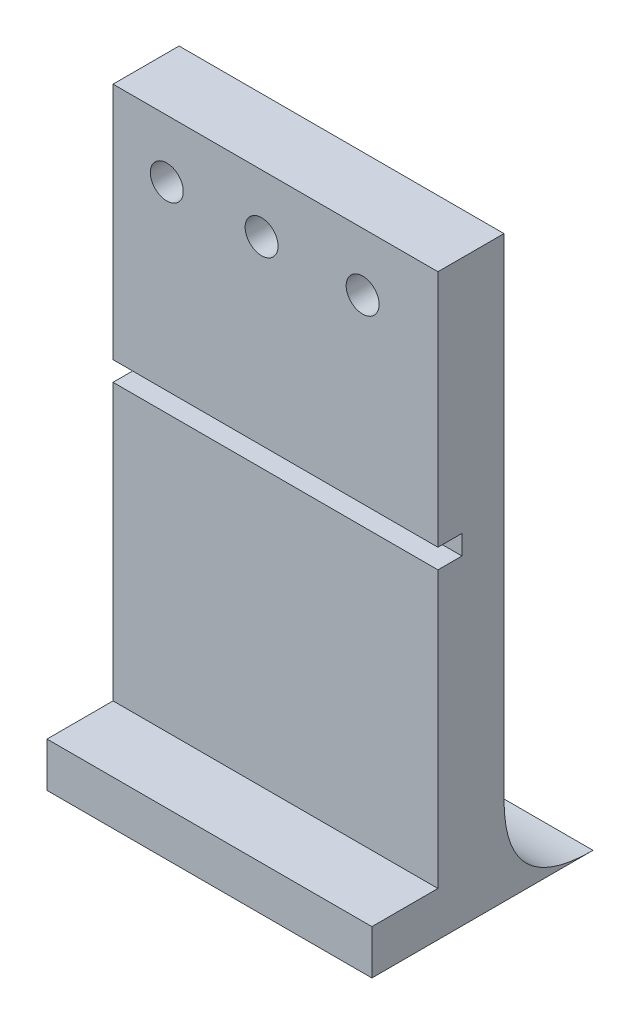
ISO-10303-21;
HEADER;
FILE_DESCRIPTION(('STEP AP214'),'2;1');
FILE_NAME('part.step','',(''),(''),'','','');
FILE_SCHEMA(('AUTOMOTIVE_DESIGN { 1 0 10303 214 1 1 1 1 }'));
ENDSEC;
DATA;
#1=APPLICATION_CONTEXT('core data for automotive mechanical design processes');
#2=APPLICATION_PROTOCOL_DEFINITION('international standard','automotive_design',2000,#1);
#3=PRODUCT_CONTEXT('',#1,'mechanical');
#4=PRODUCT('Part','Part','',(#3));
#5=PRODUCT_RELATED_PRODUCT_CATEGORY('part','',(#4));
#6=PRODUCT_DEFINITION_FORMATION('','',#4);
#7=PRODUCT_DEFINITION_CONTEXT('part definition',#1,'design');
#8=PRODUCT_DEFINITION('design','',#6,#7);
#9=PRODUCT_DEFINITION_SHAPE('','',#8);
#10=(LENGTH_UNIT() NAMED_UNIT(*) SI_UNIT(.MILLI.,.METRE.));
#11=(NAMED_UNIT(*) PLANE_ANGLE_UNIT() SI_UNIT($,.RADIAN.));
#12=(NAMED_UNIT(*) SI_UNIT($,.STERADIAN.) SOLID_ANGLE_UNIT());
#13=UNCERTAINTY_MEASURE_WITH_UNIT(LENGTH_MEASURE(1.E-05),#10,'distance_accuracy_value','');
#14=(GEOMETRIC_REPRESENTATION_CONTEXT(3) GLOBAL_UNCERTAINTY_ASSIGNED_CONTEXT((#13)) GLOBAL_UNIT_ASSIGNED_CONTEXT((#10,
#11,#12)) REPRESENTATION_CONTEXT('',''));
#15=CARTESIAN_POINT('',(0.,0.,0.));
#16=DIRECTION('',(0.,0.,1.));
#17=DIRECTION('',(1.,0.,0.));
#18=AXIS2_PLACEMENT_3D('',#15,#16,#17);
#19=CARTESIAN_POINT('',(-6.61487977012459,86.9756657215737,123.391810220685));
#20=DIRECTION('',(0.,-1.,0.));
#21=DIRECTION('',(-1.,0.,0.));
#22=AXIS2_PLACEMENT_3D('',#19,#20,#21);
#23=PLANE('',#22);
#24=DIRECTION('',(0.,0.,-1.));
#25=VECTOR('',#24,1.);
#26=CARTESIAN_POINT('',(29.8795748109969,86.975665721574,135.86462945309));
#27=LINE('',#26,#25);
#28=CARTESIAN_POINT('',(29.8795748109969,86.975665721574,150.703034062997));
#29=VERTEX_POINT('',#28);
#30=CARTESIAN_POINT('',(29.8795748109969,86.975665721574,125.86462945309));
#31=VERTEX_POINT('',#30);
#32=EDGE_CURVE('E137',#29,#31,#27,.T.);
#33=ORIENTED_EDGE('',*,*,#32,.F.);
#34=DIRECTION('',(1.,0.,0.));
#35=VECTOR('',#34,1.);
#36=CARTESIAN_POINT('',(-6.61487977012459,86.9756657215737,150.703034062997));
#37=LINE('',#36,#35);
#38=CARTESIAN_POINT('',(-6.61487977012459,86.9756657215737,150.703034062997));
#39=VERTEX_POINT('',#38);
#40=EDGE_CURVE('E291',#39,#29,#37,.T.);
#41=ORIENTED_EDGE('',*,*,#40,.F.);
#42=DIRECTION('',(0.,0.,1.));
#43=VECTOR('',#42,1.);
#44=CARTESIAN_POINT('',(-6.61487977012459,86.9756657215737,135.86462945309));
#45=LINE('',#44,#43);
#46=CARTESIAN_POINT('',(-6.61490549374412,86.9756657215737,126.010686228357));
#47=VERTEX_POINT('',#46);
#48=EDGE_CURVE('E243',#47,#39,#45,.T.);
#49=ORIENTED_EDGE('',*,*,#48,.F.);
#50=CARTESIAN_POINT('',(-6.09436975174915,86.9756657215737,125.86462945309));
#51=CARTESIAN_POINT('',(-6.2771836526026,86.9756657215751,125.915142450275));
#52=CARTESIAN_POINT('',(-6.45933515818465,86.9756657215727,125.966293432335));
#53=CARTESIAN_POINT('',(-6.64080924759801,86.9756657215737,126.018065868743));
#54=(BOUNDED_CURVE() B_SPLINE_CURVE(3,(#50,#51,#52,#53),.UNSPECIFIED.,.F.,
.F.) B_SPLINE_CURVE_WITH_KNOTS((4,4),(0.0944464940973839,0.0950368134313215),
.UNSPECIFIED.) CURVE() GEOMETRIC_REPRESENTATION_ITEM() RATIONAL_B_SPLINE_CURVE((1.,1.,1.,1.)) REPRESENTATION_ITEM(''));
#55=CARTESIAN_POINT('',(-6.09436975174916,86.9756657215737,125.864629453091));
#56=VERTEX_POINT('',#55);
#57=EDGE_CURVE('E155',#56,#47,#54,.T.);
#58=ORIENTED_EDGE('',*,*,#57,.F.);
#59=CARTESIAN_POINT('',(31.7042975400529,86.975665721574,125.86462945309));
#60=CARTESIAN_POINT('',(18.3229975269751,86.9756657215739,125.86462945309));
#61=CARTESIAN_POINT('',(4.94169751389721,86.9756657215738,125.86462945309));
#62=CARTESIAN_POINT('',(-8.43960249918066,86.9756657215737,125.86462945309));
#63=(BOUNDED_CURVE() B_SPLINE_CURVE(3,(#59,#60,#61,#62),.UNSPECIFIED.,.F.,
.F.) B_SPLINE_CURVE_WITH_KNOTS((4,4),(-0.0383191773101775,0.00182472272905607),
.UNSPECIFIED.) CURVE() GEOMETRIC_REPRESENTATION_ITEM() RATIONAL_B_SPLINE_CURVE((1.,1.,1.,1.)) REPRESENTATION_ITEM(''));
#64=EDGE_CURVE('E152',#56,#31,#63,.F.);
#65=ORIENTED_EDGE('',*,*,#64,.T.);
#66=EDGE_LOOP('',(#33,#41,#49,#58,#65));
#67=FACE_BOUND('',#66,.T.);
#68=ADVANCED_FACE('F43',(#67),#23,.T.);
#69=CARTESIAN_POINT('',(21.4220309120383,145.475665721574,123.401835220685));
#70=DIRECTION('',(0.,0.,1.));
#71=DIRECTION('',(0.,-1.,0.));
#72=AXIS2_PLACEMENT_3D('',#69,#70,#71);
#73=CYLINDRICAL_SURFACE('',#72,1.85);
#74=CARTESIAN_POINT('',(21.4220309120383,145.475665721574,143.283831758044));
#75=DIRECTION('',(0.,0.,1.));
#76=DIRECTION('',(0.,-1.,0.));
#77=AXIS2_PLACEMENT_3D('',#74,#75,#76);
#78=CIRCLE('',#77,1.85);
#79=CARTESIAN_POINT('',(21.4220309120383,143.625665721574,143.283831758044));
#80=VERTEX_POINT('',#79);
#81=EDGE_CURVE('E56',#80,#80,#78,.T.);
#82=ORIENTED_EDGE('',*,*,#81,.T.);
#83=EDGE_LOOP('',(#82));
#84=FACE_BOUND('',#83,.T.);
#85=CARTESIAN_POINT('',(21.4220309120383,145.475665721574,135.86462945309));
#86=DIRECTION('',(0.,0.,1.));
#87=DIRECTION('',(0.,-1.,0.));
#88=AXIS2_PLACEMENT_3D('',#85,#86,#87);
#89=CIRCLE('',#88,1.85);
#90=CARTESIAN_POINT('',(21.4220309120383,143.625665721574,135.86462945309));
#91=VERTEX_POINT('',#90);
#92=EDGE_CURVE('E349',#91,#91,#89,.T.);
#93=ORIENTED_EDGE('',*,*,#92,.F.);
#94=EDGE_LOOP('',(#93));
#95=FACE_BOUND('',#94,.T.);
#96=ADVANCED_FACE('F363',(#84,#95),#73,.F.);
#97=CARTESIAN_POINT('',(10.0710965883469,145.475665721574,123.401835220685));
#98=DIRECTION('',(0.,0.,1.));
#99=DIRECTION('',(0.,-1.,0.));
#100=AXIS2_PLACEMENT_3D('',#97,#98,#99);
#101=CYLINDRICAL_SURFACE('',#100,1.85);
#102=CARTESIAN_POINT('',(10.0710965883469,145.475665721574,143.283831758044));
#103=DIRECTION('',(0.,0.,1.));
#104=DIRECTION('',(0.,-1.,0.));
#105=AXIS2_PLACEMENT_3D('',#102,#103,#104);
#106=CIRCLE('',#105,1.85);
#107=CARTESIAN_POINT('',(10.0710965883469,143.625665721574,143.283831758044));
#108=VERTEX_POINT('',#107);
#109=EDGE_CURVE('E343',#108,#108,#106,.T.);
#110=ORIENTED_EDGE('',*,*,#109,.T.);
#111=EDGE_LOOP('',(#110));
#112=FACE_BOUND('',#111,.T.);
#113=CARTESIAN_POINT('',(10.0710965883469,145.475665721574,135.86462945309));
#114=DIRECTION('',(0.,0.,1.));
#115=DIRECTION('',(0.,-1.,0.));
#116=AXIS2_PLACEMENT_3D('',#113,#114,#115);
#117=CIRCLE('',#116,1.85);
#118=CARTESIAN_POINT('',(10.0710965883469,143.625665721574,135.86462945309));
#119=VERTEX_POINT('',#118);
#120=EDGE_CURVE('E413',#119,#119,#117,.T.);
#121=ORIENTED_EDGE('',*,*,#120,.F.);
#122=EDGE_LOOP('',(#121));
#123=FACE_BOUND('',#122,.T.);
#124=ADVANCED_FACE('F369',(#112,#123),#101,.F.);
#125=CARTESIAN_POINT('',(-0.577969087961711,145.475665721574,123.401835220685));
#126=DIRECTION('',(0.,0.,1.));
#127=DIRECTION('',(0.,-1.,0.));
#128=AXIS2_PLACEMENT_3D('',#125,#126,#127);
#129=CYLINDRICAL_SURFACE('',#128,1.85);
#130=CARTESIAN_POINT('',(-0.577969087961711,145.475665721574,143.283831758044));
#131=DIRECTION('',(0.,0.,1.));
#132=DIRECTION('',(0.,-1.,0.));
#133=AXIS2_PLACEMENT_3D('',#130,#131,#132);
#134=CIRCLE('',#133,1.85);
#135=CARTESIAN_POINT('',(-0.577969087961698,143.625665721574,143.283831758044));
#136=VERTEX_POINT('',#135);
#137=EDGE_CURVE('E346',#136,#136,#134,.T.);
#138=ORIENTED_EDGE('',*,*,#137,.T.);
#139=EDGE_LOOP('',(#138));
#140=FACE_BOUND('',#139,.T.);
#141=CARTESIAN_POINT('',(-0.577969087961711,145.475665721574,135.86462945309));
#142=DIRECTION('',(0.,0.,1.));
#143=DIRECTION('',(0.,-1.,0.));
#144=AXIS2_PLACEMENT_3D('',#141,#142,#143);
#145=CIRCLE('',#144,1.85);
#146=CARTESIAN_POINT('',(-0.577969087961698,143.625665721574,135.86462945309));
#147=VERTEX_POINT('',#146);
#148=EDGE_CURVE('E340',#147,#147,#145,.T.);
#149=ORIENTED_EDGE('',*,*,#148,.F.);
#150=EDGE_LOOP('',(#149));
#151=FACE_BOUND('',#150,.T.);
#152=ADVANCED_FACE('F364',(#140,#151),#129,.F.);
#153=CARTESIAN_POINT('',(-1.06114032678954E-12,151.975665721574,0.));
#154=DIRECTION('',(0.,-1.,0.));
#155=DIRECTION('',(-1.,0.,0.));
#156=AXIS2_PLACEMENT_3D('',#153,#154,#155);
#157=PLANE('',#156);
#158=DIRECTION('',(0.,0.,1.));
#159=VECTOR('',#158,1.);
#160=CARTESIAN_POINT('',(-6.61487977012505,151.975665721574,143.283831758044));
#161=LINE('',#160,#159);
#162=CARTESIAN_POINT('',(-6.61487977012505,151.975665721574,135.86462945309));
#163=VERTEX_POINT('',#162);
#164=CARTESIAN_POINT('',(-6.61487977012505,151.975665721574,143.283831758044));
#165=VERTEX_POINT('',#164);
#166=EDGE_CURVE('E312',#163,#165,#161,.T.);
#167=ORIENTED_EDGE('',*,*,#166,.T.);
#168=DIRECTION('',(1.,0.,0.));
#169=VECTOR('',#168,1.);
#170=CARTESIAN_POINT('',(-6.61487977012505,151.975665721574,143.283831758044));
#171=LINE('',#170,#169);
#172=CARTESIAN_POINT('',(29.8795748109964,151.975665721574,143.283831758044));
#173=VERTEX_POINT('',#172);
#174=EDGE_CURVE('E319',#165,#173,#171,.T.);
#175=ORIENTED_EDGE('',*,*,#174,.T.);
#176=DIRECTION('',(0.,0.,-1.));
#177=VECTOR('',#176,1.);
#178=CARTESIAN_POINT('',(29.8795748109964,151.975665721574,143.283831758044));
#179=LINE('',#178,#177);
#180=CARTESIAN_POINT('',(29.8795748109964,151.975665721574,135.86462945309));
#181=VERTEX_POINT('',#180);
#182=EDGE_CURVE('E316',#173,#181,#179,.T.);
#183=ORIENTED_EDGE('',*,*,#182,.T.);
#184=DIRECTION('',(-1.,0.,0.));
#185=VECTOR('',#184,1.);
#186=CARTESIAN_POINT('',(-6.61487977012505,151.975665721574,135.86462945309));
#187=LINE('',#186,#185);
#188=EDGE_CURVE('E313',#181,#163,#187,.T.);
#189=ORIENTED_EDGE('',*,*,#188,.T.);
#190=EDGE_LOOP('',(#167,#175,#183,#189));
#191=FACE_BOUND('',#190,.T.);
#192=ADVANCED_FACE('F368',(#191),#157,.F.);
#193=CARTESIAN_POINT('',(-6.6148797701249,131.37139476091,150.703034062997));
#194=DIRECTION('',(0.,0.,-1.));
#195=DIRECTION('',(0.,1.,0.));
#196=AXIS2_PLACEMENT_3D('',#193,#194,#195);
#197=PLANE('',#196);
#198=DIRECTION('',(1.,0.,0.));
#199=VECTOR('',#198,1.);
#200=CARTESIAN_POINT('',(-6.6148797701249,91.9756657215738,150.703034062997));
#201=LINE('',#200,#199);
#202=CARTESIAN_POINT('',(-6.61487977012463,91.9756657215737,150.703034062997));
#203=VERTEX_POINT('',#202);
#204=CARTESIAN_POINT('',(29.8795748109968,91.9756657215738,150.703034062997));
#205=VERTEX_POINT('',#204);
#206=EDGE_CURVE('E296',#203,#205,#201,.T.);
#207=ORIENTED_EDGE('',*,*,#206,.F.);
#208=DIRECTION('',(0.,-1.,0.));
#209=VECTOR('',#208,1.);
#210=CARTESIAN_POINT('',(-6.6148797701249,131.37139476091,150.703034062997));
#211=LINE('',#210,#209);
#212=EDGE_CURVE('E292',#203,#39,#211,.T.);
#213=ORIENTED_EDGE('',*,*,#212,.T.);
#214=ORIENTED_EDGE('',*,*,#40,.T.);
#215=DIRECTION('',(0.,-1.,0.));
#216=VECTOR('',#215,1.);
#217=CARTESIAN_POINT('',(29.8795748109966,131.371394760911,150.703034062997));
#218=LINE('',#217,#216);
#219=EDGE_CURVE('E146',#205,#29,#218,.T.);
#220=ORIENTED_EDGE('',*,*,#219,.F.);
#221=EDGE_LOOP('',(#207,#213,#214,#220));
#222=FACE_BOUND('',#221,.T.);
#223=ADVANCED_FACE('F388',(#222),#197,.F.);
#224=CARTESIAN_POINT('',(11.3419801516962,91.9756657215738,189.849114558127));
#225=DIRECTION('',(0.,1.,0.));
#226=DIRECTION('',(0.,0.,1.));
#227=AXIS2_PLACEMENT_3D('',#224,#225,#226);
#228=PLANE('',#227);
#229=DIRECTION('',(1.,0.,0.));
#230=VECTOR('',#229,1.);
#231=CARTESIAN_POINT('',(-6.61487977012463,91.9756657215738,143.283831758044));
#232=LINE('',#231,#230);
#233=CARTESIAN_POINT('',(-6.61487977012463,91.9756657215738,143.283831758044));
#234=VERTEX_POINT('',#233);
#235=CARTESIAN_POINT('',(29.8795748109968,91.975665721574,143.283831758044));
#236=VERTEX_POINT('',#235);
#237=EDGE_CURVE('E308',#234,#236,#232,.T.);
#238=ORIENTED_EDGE('',*,*,#237,.F.);
#239=DIRECTION('',(0.,0.,1.));
#240=VECTOR('',#239,1.);
#241=CARTESIAN_POINT('',(-6.61487977012463,91.9756657215738,135.86462945309));
#242=LINE('',#241,#240);
#243=EDGE_CURVE('E283',#234,#203,#242,.T.);
#244=ORIENTED_EDGE('',*,*,#243,.T.);
#245=ORIENTED_EDGE('',*,*,#206,.T.);
#246=DIRECTION('',(0.,0.,-1.));
#247=VECTOR('',#246,1.);
#248=CARTESIAN_POINT('',(29.8795748109968,91.9756657215738,135.86462945309));
#249=LINE('',#248,#247);
#250=EDGE_CURVE('E236',#205,#236,#249,.T.);
#251=ORIENTED_EDGE('',*,*,#250,.T.);
#252=EDGE_LOOP('',(#238,#244,#245,#251));
#253=FACE_BOUND('',#252,.T.);
#254=ADVANCED_FACE('F200',(#253),#228,.T.);
#255=CARTESIAN_POINT('',(-6.61487977012505,151.975665721574,143.283831758044));
#256=DIRECTION('',(0.,0.,-1.));
#257=DIRECTION('',(0.,1.,0.));
#258=AXIS2_PLACEMENT_3D('',#255,#256,#257);
#259=PLANE('',#258);
#260=DIRECTION('',(0.,-1.,0.));
#261=VECTOR('',#260,1.);
#262=CARTESIAN_POINT('',(29.8795748109964,151.975665721574,143.283831758044));
#263=LINE('',#262,#261);
#264=CARTESIAN_POINT('',(29.8795748109966,122.971120568559,143.283831758044));
#265=VERTEX_POINT('',#264);
#266=EDGE_CURVE('E307',#265,#236,#263,.T.);
#267=ORIENTED_EDGE('',*,*,#266,.F.);
#268=DIRECTION('',(-1.,0.,0.));
#269=VECTOR('',#268,1.);
#270=CARTESIAN_POINT('',(-6.61487977012484,122.971120568558,143.283831758044));
#271=LINE('',#270,#269);
#272=CARTESIAN_POINT('',(-6.61487977012484,122.971120568558,143.283831758044));
#273=VERTEX_POINT('',#272);
#274=EDGE_CURVE('E71',#265,#273,#271,.T.);
#275=ORIENTED_EDGE('',*,*,#274,.T.);
#276=DIRECTION('',(0.,-1.,0.));
#277=VECTOR('',#276,1.);
#278=CARTESIAN_POINT('',(-6.61487977012505,151.975665721574,143.283831758044));
#279=LINE('',#278,#277);
#280=EDGE_CURVE('E304',#273,#234,#279,.T.);
#281=ORIENTED_EDGE('',*,*,#280,.T.);
#282=ORIENTED_EDGE('',*,*,#237,.T.);
#283=EDGE_LOOP('',(#267,#275,#281,#282));
#284=FACE_BOUND('',#283,.T.);
#285=ADVANCED_FACE('F267',(#284),#259,.F.);
#286=CARTESIAN_POINT('',(-47.0807870095863,122.971120568558,143.283831758044));
#287=DIRECTION('',(0.,-1.,0.));
#288=DIRECTION('',(-1.,0.,0.));
#289=AXIS2_PLACEMENT_3D('',#286,#287,#288);
#290=PLANE('',#289);
#291=ORIENTED_EDGE('',*,*,#274,.F.);
#292=DIRECTION('',(0.,0.,-1.));
#293=VECTOR('',#292,1.);
#294=CARTESIAN_POINT('',(29.8795748109966,122.971120568559,143.283831758044));
#295=LINE('',#294,#293);
#296=CARTESIAN_POINT('',(29.8795748109966,122.971120568559,140.585777531945));
#297=VERTEX_POINT('',#296);
#298=EDGE_CURVE('E337',#265,#297,#295,.T.);
#299=ORIENTED_EDGE('',*,*,#298,.T.);
#300=DIRECTION('',(1.,0.,0.));
#301=VECTOR('',#300,1.);
#302=CARTESIAN_POINT('',(-47.0807870095863,122.971120568558,140.585777531945));
#303=LINE('',#302,#301);
#304=CARTESIAN_POINT('',(-6.61487977012484,122.971120568558,140.585777531945));
#305=VERTEX_POINT('',#304);
#306=EDGE_CURVE('E331',#305,#297,#303,.T.);
#307=ORIENTED_EDGE('',*,*,#306,.F.);
#308=DIRECTION('',(0.,0.,-1.));
#309=VECTOR('',#308,1.);
#310=CARTESIAN_POINT('',(-6.61487977012484,122.971120568558,135.86462945309));
#311=LINE('',#310,#309);
#312=EDGE_CURVE('E327',#273,#305,#311,.T.);
#313=ORIENTED_EDGE('',*,*,#312,.F.);
#314=EDGE_LOOP('',(#291,#299,#307,#313));
#315=FACE_BOUND('',#314,.T.);
#316=ADVANCED_FACE('F381',(#315),#290,.F.);
#317=CARTESIAN_POINT('',(-47.0807870095863,125.168346382283,140.585777531945));
#318=DIRECTION('',(0.,0.,-1.));
#319=DIRECTION('',(-1.,0.,0.));
#320=AXIS2_PLACEMENT_3D('',#317,#318,#319);
#321=PLANE('',#320);
#322=ORIENTED_EDGE('',*,*,#306,.T.);
#323=DIRECTION('',(0.,1.,0.));
#324=VECTOR('',#323,1.);
#325=CARTESIAN_POINT('',(29.8795748109966,125.168346382284,140.585777531945));
#326=LINE('',#325,#324);
#327=CARTESIAN_POINT('',(29.8795748109966,125.168346382284,140.585777531945));
#328=VERTEX_POINT('',#327);
#329=EDGE_CURVE('E333',#297,#328,#326,.T.);
#330=ORIENTED_EDGE('',*,*,#329,.T.);
#331=DIRECTION('',(1.,0.,0.));
#332=VECTOR('',#331,1.);
#333=CARTESIAN_POINT('',(-47.0807870095863,125.168346382283,140.585777531945));
#334=LINE('',#333,#332);
#335=CARTESIAN_POINT('',(-6.61487977012486,125.168346382284,140.585777531945));
#336=VERTEX_POINT('',#335);
#337=EDGE_CURVE('E330',#336,#328,#334,.T.);
#338=ORIENTED_EDGE('',*,*,#337,.F.);
#339=DIRECTION('',(0.,1.,0.));
#340=VECTOR('',#339,1.);
#341=CARTESIAN_POINT('',(-6.6148797701249,131.37139476091,140.585777531945));
#342=LINE('',#341,#340);
#343=EDGE_CURVE('E311',#305,#336,#342,.T.);
#344=ORIENTED_EDGE('',*,*,#343,.F.);
#345=EDGE_LOOP('',(#322,#330,#338,#344));
#346=FACE_BOUND('',#345,.T.);
#347=ADVANCED_FACE('F377',(#346),#321,.F.);
#348=CARTESIAN_POINT('',(-47.0807870095863,125.168346382283,143.283831758044));
#349=DIRECTION('',(0.,1.,0.));
#350=DIRECTION('',(1.,0.,0.));
#351=AXIS2_PLACEMENT_3D('',#348,#349,#350);
#352=PLANE('',#351);
#353=ORIENTED_EDGE('',*,*,#337,.T.);
#354=DIRECTION('',(0.,0.,1.));
#355=VECTOR('',#354,1.);
#356=CARTESIAN_POINT('',(29.8795748109966,125.168346382284,143.283831758044));
#357=LINE('',#356,#355);
#358=CARTESIAN_POINT('',(29.8795748109966,125.168346382284,143.283831758044));
#359=VERTEX_POINT('',#358);
#360=EDGE_CURVE('E63',#328,#359,#357,.T.);
#361=ORIENTED_EDGE('',*,*,#360,.T.);
#362=DIRECTION('',(1.,0.,0.));
#363=VECTOR('',#362,1.);
#364=CARTESIAN_POINT('',(-6.61487977012486,125.168346382284,143.283831758044));
#365=LINE('',#364,#363);
#366=CARTESIAN_POINT('',(-6.61487977012486,125.168346382284,143.283831758044));
#367=VERTEX_POINT('',#366);
#368=EDGE_CURVE('E398',#367,#359,#365,.T.);
#369=ORIENTED_EDGE('',*,*,#368,.F.);
#370=DIRECTION('',(0.,0.,1.));
#371=VECTOR('',#370,1.);
#372=CARTESIAN_POINT('',(-6.61487977012486,125.168346382284,135.86462945309));
#373=LINE('',#372,#371);
#374=EDGE_CURVE('E324',#336,#367,#373,.T.);
#375=ORIENTED_EDGE('',*,*,#374,.F.);
#376=EDGE_LOOP('',(#353,#361,#369,#375));
#377=FACE_BOUND('',#376,.T.);
#378=ADVANCED_FACE('F380',(#377),#352,.F.);
#379=ORIENTED_EDGE('',*,*,#137,.F.);
#380=EDGE_LOOP('',(#379));
#381=FACE_BOUND('',#380,.T.);
#382=ORIENTED_EDGE('',*,*,#109,.F.);
#383=EDGE_LOOP('',(#382));
#384=FACE_BOUND('',#383,.T.);
#385=ORIENTED_EDGE('',*,*,#81,.F.);
#386=EDGE_LOOP('',(#385));
#387=FACE_BOUND('',#386,.T.);
#388=EDGE_CURVE('E301',#165,#367,#279,.T.);
#389=ORIENTED_EDGE('',*,*,#388,.T.);
#390=ORIENTED_EDGE('',*,*,#368,.T.);
#391=EDGE_CURVE('E305',#173,#359,#263,.T.);
#392=ORIENTED_EDGE('',*,*,#391,.F.);
#393=ORIENTED_EDGE('',*,*,#174,.F.);
#394=EDGE_LOOP('',(#389,#390,#392,#393));
#395=FACE_BOUND('',#394,.T.);
#396=ADVANCED_FACE('F386',(#381,#384,#387,#395),#259,.F.);
#397=CARTESIAN_POINT('',(-6.6148797701249,131.37139476091,135.86462945309));
#398=DIRECTION('',(1.,0.,0.));
#399=DIRECTION('',(0.,-1.,0.));
#400=AXIS2_PLACEMENT_3D('',#397,#398,#399);
#401=PLANE('',#400);
#402=ORIENTED_EDGE('',*,*,#343,.T.);
#403=ORIENTED_EDGE('',*,*,#374,.T.);
#404=ORIENTED_EDGE('',*,*,#388,.F.);
#405=ORIENTED_EDGE('',*,*,#166,.F.);
#406=DIRECTION('',(0.,-1.,0.));
#407=VECTOR('',#406,1.);
#408=CARTESIAN_POINT('',(-6.6148797701249,131.37139476091,135.86462945309));
#409=LINE('',#408,#407);
#410=CARTESIAN_POINT('',(-6.61487977012466,96.9746791173304,135.86462945309));
#411=VERTEX_POINT('',#410);
#412=EDGE_CURVE('E245',#163,#411,#409,.T.);
#413=ORIENTED_EDGE('',*,*,#412,.T.);
#414=CARTESIAN_POINT('',(-6.61487977012459,86.9756659707116,126.010691092073));
#415=CARTESIAN_POINT('',(-6.61487977358204,86.9783952287279,126.196964759535));
#416=CARTESIAN_POINT('',(-6.61487876247804,86.9837491166597,126.383216442416));
#417=CARTESIAN_POINT('',(-6.6148749886905,87.0000196610555,126.751266364444));
#418=CARTESIAN_POINT('',(-6.61487226601208,87.0108081777291,126.933070335007));
#419=CARTESIAN_POINT('',(-6.61486540329519,87.0380328992175,127.292140595512));
#420=CARTESIAN_POINT('',(-6.61486129658847,87.054336319279,127.46941679615));
#421=CARTESIAN_POINT('',(-6.61485198706484,87.0926881259767,127.819333579255));
#422=CARTESIAN_POINT('',(-6.6148468108619,87.1145996423808,127.991989048148));
#423=CARTESIAN_POINT('',(-6.61483566346742,87.1642614427282,128.332568614598));
#424=CARTESIAN_POINT('',(-6.614829712373,87.1918719895896,128.500512949436));
#425=CARTESIAN_POINT('',(-6.61481729723885,87.2530258711277,128.831572651085));
#426=CARTESIAN_POINT('',(-6.61481084706405,87.2864280944062,128.994713939825));
#427=CARTESIAN_POINT('',(-6.61479769562865,87.3592581434547,129.316069311943));
#428=CARTESIAN_POINT('',(-6.61479100243629,87.3985454004467,129.474315101133));
#429=CARTESIAN_POINT('',(-6.61477760606407,87.4832369836697,129.785780553743));
#430=CARTESIAN_POINT('',(-6.61477090574813,87.5285036171323,129.939037502663));
#431=CARTESIAN_POINT('',(-6.61475771472493,87.625243545064,130.240426045569));
#432=CARTESIAN_POINT('',(-6.61475122244193,87.6765847711263,130.388599877796));
#433=CARTESIAN_POINT('',(-6.61473864486205,87.7855612807554,130.679723167312));
#434=CARTESIAN_POINT('',(-6.61473255448818,87.8430732272149,130.822718646348));
#435=CARTESIAN_POINT('',(-6.614720955154,87.9644757348212,131.103386657507));
#436=CARTESIAN_POINT('',(-6.61471543871468,88.0282550532622,131.241107178585));
#437=CARTESIAN_POINT('',(-6.61470513802738,88.1622748499751,131.511129035414));
#438=CARTESIAN_POINT('',(-6.61470034512449,88.232419605016,131.64347775871));
#439=CARTESIAN_POINT('',(-6.61469161792659,88.3792469503979,131.902658442836));
#440=CARTESIAN_POINT('',(-6.61468767509606,88.4558526463188,132.029533913117));
#441=CARTESIAN_POINT('',(-6.61468074963339,88.6156869780103,132.277686159934));
#442=CARTESIAN_POINT('',(-6.6146777598641,88.6988602713204,132.398998432246));
#443=CARTESIAN_POINT('',(-6.61467404837764,88.8287510875228,132.576854457851));
#444=CARTESIAN_POINT('',(-6.61467294141119,88.8728171630395,132.635350233225));
#445=CARTESIAN_POINT('',(-6.61467099227098,88.9626261156639,132.750912823912));
#446=CARTESIAN_POINT('',(-6.61467014973081,89.0083665735544,132.807981514799));
#447=CARTESIAN_POINT('',(-6.61466873527096,89.1015336389136,132.920676065817));
#448=CARTESIAN_POINT('',(-6.61466816321366,89.1489593756904,132.976302646037));
#449=CARTESIAN_POINT('',(-6.61466729370582,89.2455080824322,133.086102576054));
#450=CARTESIAN_POINT('',(-6.61466699636471,89.2946317206464,133.140275338417));
#451=CARTESIAN_POINT('',(-6.6146666787203,89.3945869158201,133.247156444248));
#452=CARTESIAN_POINT('',(-6.61466665878489,89.445420651191,133.299862750561));
#453=CARTESIAN_POINT('',(-6.61466689673672,89.5488069256592,133.403800097716));
#454=CARTESIAN_POINT('',(-6.61466715525454,89.6013631035657,133.455027519192));
#455=CARTESIAN_POINT('',(-6.61466794926193,89.7082052148833,133.555996276759));
#456=CARTESIAN_POINT('',(-6.61466848564145,89.7624961771553,133.605732291324));
#457=CARTESIAN_POINT('',(-6.61466983286924,89.8728189361045,133.703707509157));
#458=CARTESIAN_POINT('',(-6.6146706448557,89.9288570622226,133.751939584744));
#459=CARTESIAN_POINT('',(-6.61467253913374,90.0426853684619,133.846896256345));
#460=CARTESIAN_POINT('',(-6.61467362279282,90.1004830717522,133.89361183285));
#461=CARTESIAN_POINT('',(-6.61467605457941,90.217841891377,133.985524874138));
#462=CARTESIAN_POINT('',(-6.61467740427719,90.277411602629,134.030711362331));
#463=CARTESIAN_POINT('',(-6.61468036062549,90.3983260303408,134.119555639835));
#464=CARTESIAN_POINT('',(-6.61468196901534,90.4596802797514,134.163200452345));
#465=CARTESIAN_POINT('',(-6.61468543352382,90.5841753193348,134.248950696091));
#466=CARTESIAN_POINT('',(-6.61468729151041,90.647326435383,134.291041129082));
#467=CARTESIAN_POINT('',(-6.61469124433426,90.7754278336328,134.373672260118));
#468=CARTESIAN_POINT('',(-6.61469334112235,90.8403890930425,134.414195943886));
#469=CARTESIAN_POINT('',(-6.61469775875384,90.9721201967071,134.493681839444));
#470=CARTESIAN_POINT('',(-6.61470008157789,91.0389014857223,134.532625033262));
#471=CARTESIAN_POINT('',(-6.61470740547942,91.243107735076,134.647731212529));
#472=CARTESIAN_POINT('',(-6.6147126957582,91.3822849368722,134.720811376831));
#473=CARTESIAN_POINT('',(-6.61472397337354,91.667975045384,134.860676937615));
#474=CARTESIAN_POINT('',(-6.6147299745866,91.8145841047151,134.927264830362));
#475=CARTESIAN_POINT('',(-6.61474251084021,92.115252179382,135.05407885942));
#476=CARTESIAN_POINT('',(-6.61474905598727,92.2694052969083,135.114081418004));
#477=CARTESIAN_POINT('',(-6.61476248847134,92.5852658040898,135.227643962307));
#478=CARTESIAN_POINT('',(-6.61476938018967,92.7470612947943,135.28095793042));
#479=CARTESIAN_POINT('',(-6.61478328549286,93.0783190474119,135.381060540528));
#480=CARTESIAN_POINT('',(-6.61479029589781,93.247860777149,135.427585077898));
#481=CARTESIAN_POINT('',(-6.61480418869009,93.594725575884,135.514020422133));
#482=CARTESIAN_POINT('',(-6.61481105866926,93.7721175196625,135.553653363713));
#483=CARTESIAN_POINT('',(-6.61482439043672,94.1348001389042,135.626212337295));
#484=CARTESIAN_POINT('',(-6.61483082913261,94.3201479555402,135.658850924713));
#485=CARTESIAN_POINT('',(-6.61484298682474,94.6988609301917,135.717323653869));
#486=CARTESIAN_POINT('',(-6.61484867080057,94.8922709846306,135.742864611793));
#487=CARTESIAN_POINT('',(-6.61485897615695,95.2872295534196,135.787038896108));
#488=CARTESIAN_POINT('',(-6.61486354958781,95.488810808864,135.805376621774));
#489=CARTESIAN_POINT('',(-6.61487125562641,95.9002278115595,135.835042998573));
#490=CARTESIAN_POINT('',(-6.61487432642975,96.110084360286,135.846076715315));
#491=CARTESIAN_POINT('',(-6.61487862512232,96.5381904958784,135.86100848777));
#492=CARTESIAN_POINT('',(-6.61487977707194,96.7564505188318,135.864613792573));
#493=CARTESIAN_POINT('',(-6.61487977006874,96.9746791027762,135.86462945309));
#494=B_SPLINE_CURVE_WITH_KNOTS('',3,(#414,#415,#416,#417,#418,#419,#420,#421,#422,#423,#424,
#425,#426,#427,#428,#429,#430,#431,#432,#433,#434,#435,#436,#437,#438,#439,#440,#441,#442,#443,
#444,#445,#446,#447,#448,#449,#450,#451,#452,#453,#454,#455,#456,#457,#458,#459,#460,#461,#462,
#463,#464,#465,#466,#467,#468,#469,#470,#471,#472,#473,#474,#475,#476,#477,#478,#479,#480,#481,
#482,#483,#484,#485,#486,#487,#488,#489,#490,#491,#492,#493),.UNSPECIFIED.,.F.,.F.,(4,2,2,2,2,2,
2,2,2,2,2,2,2,2,2,2,2,2,2,2,2,2,2,2,2,2,2,2,2,2,2,2,2,2,2,2,2,2,2,4),(0.,0.558886551682193,
1.10517243643766,1.63914461525739,2.16115560478094,2.67163026526553,3.17107285584755,
3.66007418517452,4.13931861375088,4.6095905830666,5.07178026208733,5.52688782488896,
5.9760258199514,6.42041908164492,6.86140168826027,7.0810837646705,7.30046007730153,
7.51972465253679,7.73907652979313,7.95871927930829,8.17886047997167,8.39971116379724,
8.62148523456446,8.84439886884812,9.06866990808896,9.29451725049923,9.52216025144613,
9.75181814052781,9.98370946287552,10.4550104345593,10.9378303760997,11.4338445556922,
11.9446767889464,12.4718916587309,13.0169895476996,13.5814041585793,14.1665021097988,
14.7735841677438,15.403887695553,16.0585899450367),.UNSPECIFIED.);
#495=EDGE_CURVE('E166',#411,#47,#494,.F.);
#496=ORIENTED_EDGE('',*,*,#495,.T.);
#497=ORIENTED_EDGE('',*,*,#48,.T.);
#498=ORIENTED_EDGE('',*,*,#212,.F.);
#499=ORIENTED_EDGE('',*,*,#243,.F.);
#500=ORIENTED_EDGE('',*,*,#280,.F.);
#501=ORIENTED_EDGE('',*,*,#312,.T.);
#502=EDGE_LOOP('',(#402,#403,#404,#405,#413,#496,#497,#498,#499,#500,#501));
#503=FACE_BOUND('',#502,.T.);
#504=ADVANCED_FACE('F241',(#503),#401,.F.);
#505=CARTESIAN_POINT('',(-6.6148797701249,131.37139476091,135.86462945309));
#506=DIRECTION('',(0.,0.,1.));
#507=DIRECTION('',(0.,-1.,0.));
#508=AXIS2_PLACEMENT_3D('',#505,#506,#507);
#509=PLANE('',#508);
#510=ORIENTED_EDGE('',*,*,#148,.T.);
#511=EDGE_LOOP('',(#510));
#512=FACE_BOUND('',#511,.T.);
#513=ORIENTED_EDGE('',*,*,#120,.T.);
#514=EDGE_LOOP('',(#513));
#515=FACE_BOUND('',#514,.T.);
#516=ORIENTED_EDGE('',*,*,#92,.T.);
#517=EDGE_LOOP('',(#516));
#518=FACE_BOUND('',#517,.T.);
#519=DIRECTION('',(0.,-1.,0.));
#520=VECTOR('',#519,1.);
#521=CARTESIAN_POINT('',(29.8795748109966,131.371394760911,135.86462945309));
#522=LINE('',#521,#520);
#523=CARTESIAN_POINT('',(29.8795748109968,96.975665721574,135.86462945309));
#524=VERTEX_POINT('',#523);
#525=EDGE_CURVE('E149',#181,#524,#522,.T.);
#526=ORIENTED_EDGE('',*,*,#525,.T.);
#527=CARTESIAN_POINT('',(-8.43960249918073,96.9756657215737,135.86462945309));
#528=CARTESIAN_POINT('',(4.94169751389714,96.9756657215738,135.86462945309));
#529=CARTESIAN_POINT('',(18.322997526975,96.9756657215739,135.86462945309));
#530=CARTESIAN_POINT('',(31.7042975400529,96.975665721574,135.86462945309));
#531=(BOUNDED_CURVE() B_SPLINE_CURVE(3,(#527,#528,#529,#530),.UNSPECIFIED.,.F.,
.F.) B_SPLINE_CURVE_WITH_KNOTS((4,4),(-0.0383191773101775,0.00182472272905607),
.UNSPECIFIED.) CURVE() GEOMETRIC_REPRESENTATION_ITEM() RATIONAL_B_SPLINE_CURVE((1.,1.,1.,1.)) REPRESENTATION_ITEM(''));
#532=CARTESIAN_POINT('',(-6.09436975174923,96.9756657215737,135.86462945309));
#533=VERTEX_POINT('',#532);
#534=EDGE_CURVE('E164',#524,#533,#531,.F.);
#535=ORIENTED_EDGE('',*,*,#534,.T.);
#536=CARTESIAN_POINT('',(-6.68458286340316,96.9743926973897,135.86462945309));
#537=CARTESIAN_POINT('',(-6.48787948523846,96.9752538487536,135.86462945309));
#538=CARTESIAN_POINT('',(-6.29114080096937,96.9756657216454,135.86462945309));
#539=CARTESIAN_POINT('',(-6.09436975174923,96.9756657215737,135.86462945309));
#540=(BOUNDED_CURVE() B_SPLINE_CURVE(3,(#536,#537,#538,#539),.UNSPECIFIED.,.F.,
.F.) B_SPLINE_CURVE_WITH_KNOTS((4,4),(0.0944464940973839,0.0950368134313215),
.UNSPECIFIED.) CURVE() GEOMETRIC_REPRESENTATION_ITEM() RATIONAL_B_SPLINE_CURVE((1.,1.,1.,1.)) REPRESENTATION_ITEM(''));
#541=EDGE_CURVE('E280',#533,#411,#540,.F.);
#542=ORIENTED_EDGE('',*,*,#541,.T.);
#543=ORIENTED_EDGE('',*,*,#412,.F.);
#544=ORIENTED_EDGE('',*,*,#188,.F.);
#545=EDGE_LOOP('',(#526,#535,#542,#543,#544));
#546=FACE_BOUND('',#545,.T.);
#547=ADVANCED_FACE('F198',(#512,#515,#518,#546),#509,.F.);
#548=CARTESIAN_POINT('',(-6.09436975174923,96.9756657215737,135.86462945309));
#549=CARTESIAN_POINT('',(-6.29114080096937,96.9756657216454,135.86462945309));
#550=CARTESIAN_POINT('',(-6.48787948523846,96.9752538487536,135.86462945309));
#551=CARTESIAN_POINT('',(-6.68458286340316,96.9743926973897,135.86462945309));
#552=CARTESIAN_POINT('',(-6.09436975174915,86.9756657215737,135.86462945309));
#553=CARTESIAN_POINT('',(-6.27718365557723,87.0261787196762,135.86462945309));
#554=CARTESIAN_POINT('',(-6.45954668773324,87.076564097824,135.86462945309));
#555=CARTESIAN_POINT('',(-6.64147074449761,87.1267642034529,135.86462945309));
#556=CARTESIAN_POINT('',(-6.09436975174915,86.9756657215737,125.86462945309));
#557=CARTESIAN_POINT('',(-6.2771836526026,86.9756657215751,125.915142450275));
#558=CARTESIAN_POINT('',(-6.45933515818465,86.9756657215727,125.966293432335));
#559=CARTESIAN_POINT('',(-6.64080924759801,86.9756657215737,126.018065868743));
#560=(BOUNDED_SURFACE() B_SPLINE_SURFACE(2,3,((#548,#549,#550,#551),(#552,#553,#554,#555),(#556,
#557,#558,#559)),.UNSPECIFIED.,.F.,.F.,.F.) B_SPLINE_SURFACE_WITH_KNOTS((3,3),(4,4),(0.,1.),
(0.0944464940973839,0.0950368134313215),
.UNSPECIFIED.) GEOMETRIC_REPRESENTATION_ITEM() RATIONAL_B_SPLINE_SURFACE(((1.,1.,1.,1.),(1.,1.,
1.,1.),(1.,1.,1.,1.))) REPRESENTATION_ITEM('') SURFACE());
#561=CARTESIAN_POINT('',(-6.09436975174915,86.9756657215738,125.86462945309));
#562=CARTESIAN_POINT('',(-6.09436975174915,86.9756657215738,135.86462945309));
#563=CARTESIAN_POINT('',(-6.09436975174922,96.9756657215737,135.86462945309));
#564=(BOUNDED_CURVE() B_SPLINE_CURVE(2,(#561,#562,#563),.UNSPECIFIED.,.F.,
.F.) B_SPLINE_CURVE_WITH_KNOTS((3,3),(0.,1.),
.UNSPECIFIED.) CURVE() GEOMETRIC_REPRESENTATION_ITEM() RATIONAL_B_SPLINE_CURVE((1.,1.,1.)) REPRESENTATION_ITEM(''));
#565=EDGE_CURVE('E11',#56,#533,#564,.T.);
#566=ORIENTED_EDGE('',*,*,#495,.F.);
#567=ORIENTED_EDGE('',*,*,#541,.F.);
#568=ORIENTED_EDGE('',*,*,#565,.F.);
#569=ORIENTED_EDGE('',*,*,#57,.T.);
#570=EDGE_LOOP('',(#566,#567,#568,#569));
#571=FACE_BOUND('',#570,.T.);
#572=ADVANCED_FACE('F185',(#571),#560,.T.);
#573=CARTESIAN_POINT('',(29.8795748109966,131.371394760911,135.86462945309));
#574=DIRECTION('',(-1.,0.,0.));
#575=DIRECTION('',(0.,0.,1.));
#576=AXIS2_PLACEMENT_3D('',#573,#574,#575);
#577=PLANE('',#576);
#578=ORIENTED_EDGE('',*,*,#391,.T.);
#579=ORIENTED_EDGE('',*,*,#360,.F.);
#580=ORIENTED_EDGE('',*,*,#329,.F.);
#581=ORIENTED_EDGE('',*,*,#298,.F.);
#582=ORIENTED_EDGE('',*,*,#266,.T.);
#583=ORIENTED_EDGE('',*,*,#250,.F.);
#584=ORIENTED_EDGE('',*,*,#219,.T.);
#585=ORIENTED_EDGE('',*,*,#32,.T.);
#586=CARTESIAN_POINT('',(29.8795748109968,96.975665721574,135.86462945309));
#587=CARTESIAN_POINT('',(29.8795748109969,86.975665721574,135.86462945309));
#588=CARTESIAN_POINT('',(29.8795748109969,86.975665721574,125.86462945309));
#589=(BOUNDED_CURVE() B_SPLINE_CURVE(2,(#586,#587,#588),.UNSPECIFIED.,.F.,
.F.) B_SPLINE_CURVE_WITH_KNOTS((3,3),(0.,1.),
.UNSPECIFIED.) CURVE() GEOMETRIC_REPRESENTATION_ITEM() RATIONAL_B_SPLINE_CURVE((1.,1.,1.)) REPRESENTATION_ITEM(''));
#590=EDGE_CURVE('E142',#31,#524,#589,.F.);
#591=ORIENTED_EDGE('',*,*,#590,.T.);
#592=ORIENTED_EDGE('',*,*,#525,.F.);
#593=ORIENTED_EDGE('',*,*,#182,.F.);
#594=EDGE_LOOP('',(#578,#579,#580,#581,#582,#583,#584,#585,#591,#592,#593));
#595=FACE_BOUND('',#594,.T.);
#596=ADVANCED_FACE('F140',(#595),#577,.F.);
#597=CARTESIAN_POINT('',(31.7042975400529,96.975665721574,135.86462945309));
#598=CARTESIAN_POINT('',(18.322997526975,96.9756657215739,135.86462945309));
#599=CARTESIAN_POINT('',(4.94169751389714,96.9756657215738,135.86462945309));
#600=CARTESIAN_POINT('',(-8.43960249918073,96.9756657215737,135.86462945309));
#601=CARTESIAN_POINT('',(31.7042975400529,86.975665721574,135.86462945309));
#602=CARTESIAN_POINT('',(18.3229975269751,86.9756657215739,135.86462945309));
#603=CARTESIAN_POINT('',(4.94169751389721,86.9756657215738,135.86462945309));
#604=CARTESIAN_POINT('',(-8.43960249918066,86.9756657215737,135.86462945309));
#605=CARTESIAN_POINT('',(31.7042975400529,86.975665721574,125.86462945309));
#606=CARTESIAN_POINT('',(18.3229975269751,86.9756657215739,125.86462945309));
#607=CARTESIAN_POINT('',(4.94169751389721,86.9756657215738,125.86462945309));
#608=CARTESIAN_POINT('',(-8.43960249918066,86.9756657215737,125.86462945309));
#609=(BOUNDED_SURFACE() B_SPLINE_SURFACE(2,3,((#597,#598,#599,#600),(#601,#602,#603,#604),(#605,
#606,#607,#608)),.UNSPECIFIED.,.F.,.F.,.F.) B_SPLINE_SURFACE_WITH_KNOTS((3,3),(4,4),(0.,1.),
(-0.0383191773101775,0.00182472272905607),
.UNSPECIFIED.) GEOMETRIC_REPRESENTATION_ITEM() RATIONAL_B_SPLINE_SURFACE(((1.,1.,1.,1.),(1.,1.,
1.,1.),(1.,1.,1.,1.))) REPRESENTATION_ITEM('') SURFACE());
#610=ORIENTED_EDGE('',*,*,#590,.F.);
#611=ORIENTED_EDGE('',*,*,#64,.F.);
#612=ORIENTED_EDGE('',*,*,#565,.T.);
#613=ORIENTED_EDGE('',*,*,#534,.F.);
#614=EDGE_LOOP('',(#610,#611,#612,#613));
#615=FACE_BOUND('',#614,.T.);
#616=ADVANCED_FACE('F46',(#615),#609,.T.);
#617=CLOSED_SHELL('',(#68,#96,#124,#152,#192,#223,#254,#285,#316,#347,#378,#396,#504,#547,#572,
#596,#616));
#618=MANIFOLD_SOLID_BREP('B2',#617);
#619=ADVANCED_BREP_SHAPE_REPRESENTATION('',(#18,#618),#14);
#620=SHAPE_DEFINITION_REPRESENTATION(#9,#619);
ENDSEC;
END-ISO-10303-21;
